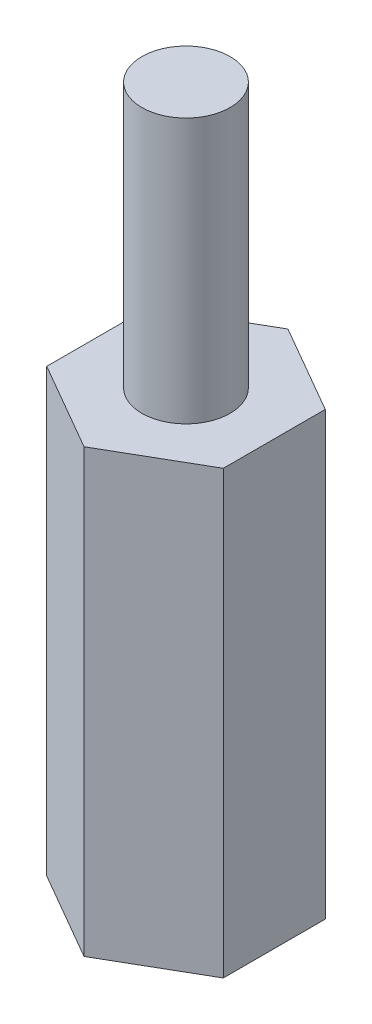
ISO-10303-21;
HEADER;
FILE_DESCRIPTION(('STEP AP214'),'2;1');
FILE_NAME('part.step','',(''),(''),'','','');
FILE_SCHEMA(('AUTOMOTIVE_DESIGN { 1 0 10303 214 1 1 1 1 }'));
ENDSEC;
DATA;
#1=APPLICATION_CONTEXT('core data for automotive mechanical design processes');
#2=APPLICATION_PROTOCOL_DEFINITION('international standard','automotive_design',2000,#1);
#3=PRODUCT_CONTEXT('',#1,'mechanical');
#4=PRODUCT('Part','Part','',(#3));
#5=PRODUCT_RELATED_PRODUCT_CATEGORY('part','',(#4));
#6=PRODUCT_DEFINITION_FORMATION('','',#4);
#7=PRODUCT_DEFINITION_CONTEXT('part definition',#1,'design');
#8=PRODUCT_DEFINITION('design','',#6,#7);
#9=PRODUCT_DEFINITION_SHAPE('','',#8);
#10=(LENGTH_UNIT() NAMED_UNIT(*) SI_UNIT(.MILLI.,.METRE.));
#11=(NAMED_UNIT(*) PLANE_ANGLE_UNIT() SI_UNIT($,.RADIAN.));
#12=(NAMED_UNIT(*) SI_UNIT($,.STERADIAN.) SOLID_ANGLE_UNIT());
#13=UNCERTAINTY_MEASURE_WITH_UNIT(LENGTH_MEASURE(1.E-05),#10,'distance_accuracy_value','');
#14=(GEOMETRIC_REPRESENTATION_CONTEXT(3) GLOBAL_UNCERTAINTY_ASSIGNED_CONTEXT((#13)) GLOBAL_UNIT_ASSIGNED_CONTEXT((#10,
#11,#12)) REPRESENTATION_CONTEXT('',''));
#15=CARTESIAN_POINT('',(0.,0.,0.));
#16=DIRECTION('',(0.,0.,1.));
#17=DIRECTION('',(1.,0.,0.));
#18=AXIS2_PLACEMENT_3D('',#15,#16,#17);
#19=CARTESIAN_POINT('',(-1.99999999999999,10.,1.15470053837928));
#20=DIRECTION('',(0.499999999999995,0.,-0.866025403784441));
#21=DIRECTION('',(-0.866025403784441,0.,-0.499999999999995));
#22=AXIS2_PLACEMENT_3D('',#19,#20,#21);
#23=PLANE('',#22);
#24=DIRECTION('',(0.866025403784442,0.,0.499999999999995));
#25=VECTOR('',#24,1.);
#26=CARTESIAN_POINT('',(-1.99999999999999,0.,1.15470053837928));
#27=LINE('',#26,#25);
#28=CARTESIAN_POINT('',(-1.99999999999999,0.,1.15470053837928));
#29=VERTEX_POINT('',#28);
#30=CARTESIAN_POINT('',(0.,0.,2.30940107675851));
#31=VERTEX_POINT('',#30);
#32=EDGE_CURVE('E119',#29,#31,#27,.T.);
#33=ORIENTED_EDGE('',*,*,#32,.T.);
#34=DIRECTION('',(0.,-1.,0.));
#35=VECTOR('',#34,1.);
#36=CARTESIAN_POINT('',(0.,10.,2.30940107675851));
#37=LINE('',#36,#35);
#38=CARTESIAN_POINT('',(0.,10.,2.30940107675851));
#39=VERTEX_POINT('',#38);
#40=EDGE_CURVE('E36',#39,#31,#37,.T.);
#41=ORIENTED_EDGE('',*,*,#40,.F.);
#42=DIRECTION('',(0.866025403784442,0.,0.499999999999995));
#43=VECTOR('',#42,1.);
#44=CARTESIAN_POINT('',(-1.99999999999999,10.,1.15470053837928));
#45=LINE('',#44,#43);
#46=CARTESIAN_POINT('',(-1.99999999999999,10.,1.15470053837928));
#47=VERTEX_POINT('',#46);
#48=EDGE_CURVE('E130',#47,#39,#45,.T.);
#49=ORIENTED_EDGE('',*,*,#48,.F.);
#50=DIRECTION('',(0.,-1.,0.));
#51=VECTOR('',#50,1.);
#52=CARTESIAN_POINT('',(-1.99999999999999,10.,1.15470053837928));
#53=LINE('',#52,#51);
#54=EDGE_CURVE('E115',#47,#29,#53,.T.);
#55=ORIENTED_EDGE('',*,*,#54,.T.);
#56=EDGE_LOOP('',(#33,#41,#49,#55));
#57=FACE_BOUND('',#56,.T.);
#58=ADVANCED_FACE('F33',(#57),#23,.F.);
#59=CARTESIAN_POINT('',(0.,10.,2.30940107675851));
#60=DIRECTION('',(-0.500000000000001,0.,-0.866025403784438));
#61=DIRECTION('',(-0.866025403784438,0.,0.500000000000001));
#62=AXIS2_PLACEMENT_3D('',#59,#60,#61);
#63=PLANE('',#62);
#64=DIRECTION('',(0.866025403784438,0.,-0.500000000000001));
#65=VECTOR('',#64,1.);
#66=CARTESIAN_POINT('',(0.,0.,2.30940107675851));
#67=LINE('',#66,#65);
#68=CARTESIAN_POINT('',(2.,0.,1.15470053837925));
#69=VERTEX_POINT('',#68);
#70=EDGE_CURVE('E122',#31,#69,#67,.T.);
#71=ORIENTED_EDGE('',*,*,#70,.T.);
#72=DIRECTION('',(0.,-1.,0.));
#73=VECTOR('',#72,1.);
#74=CARTESIAN_POINT('',(2.,10.,1.15470053837925));
#75=LINE('',#74,#73);
#76=CARTESIAN_POINT('',(2.,10.,1.15470053837925));
#77=VERTEX_POINT('',#76);
#78=EDGE_CURVE('E133',#77,#69,#75,.T.);
#79=ORIENTED_EDGE('',*,*,#78,.F.);
#80=DIRECTION('',(0.866025403784438,0.,-0.500000000000001));
#81=VECTOR('',#80,1.);
#82=CARTESIAN_POINT('',(0.,10.,2.30940107675851));
#83=LINE('',#82,#81);
#84=EDGE_CURVE('E88',#39,#77,#83,.T.);
#85=ORIENTED_EDGE('',*,*,#84,.F.);
#86=ORIENTED_EDGE('',*,*,#40,.T.);
#87=EDGE_LOOP('',(#71,#79,#85,#86));
#88=FACE_BOUND('',#87,.T.);
#89=ADVANCED_FACE('F138',(#88),#63,.F.);
#90=CARTESIAN_POINT('',(2.,10.,1.15470053837925));
#91=DIRECTION('',(-1.,0.,0.));
#92=DIRECTION('',(0.,0.,1.));
#93=AXIS2_PLACEMENT_3D('',#90,#91,#92);
#94=PLANE('',#93);
#95=DIRECTION('',(0.,0.,-1.));
#96=VECTOR('',#95,1.);
#97=CARTESIAN_POINT('',(2.,0.,1.15470053837925));
#98=LINE('',#97,#96);
#99=CARTESIAN_POINT('',(2.,0.,-1.15470053837926));
#100=VERTEX_POINT('',#99);
#101=EDGE_CURVE('E125',#69,#100,#98,.T.);
#102=ORIENTED_EDGE('',*,*,#101,.T.);
#103=DIRECTION('',(0.,-1.,0.));
#104=VECTOR('',#103,1.);
#105=CARTESIAN_POINT('',(2.,10.,-1.15470053837926));
#106=LINE('',#105,#104);
#107=CARTESIAN_POINT('',(2.,10.,-1.15470053837926));
#108=VERTEX_POINT('',#107);
#109=EDGE_CURVE('E110',#108,#100,#106,.T.);
#110=ORIENTED_EDGE('',*,*,#109,.F.);
#111=DIRECTION('',(0.,0.,-1.));
#112=VECTOR('',#111,1.);
#113=CARTESIAN_POINT('',(2.,10.,1.15470053837925));
#114=LINE('',#113,#112);
#115=EDGE_CURVE('E101',#77,#108,#114,.T.);
#116=ORIENTED_EDGE('',*,*,#115,.F.);
#117=ORIENTED_EDGE('',*,*,#78,.T.);
#118=EDGE_LOOP('',(#102,#110,#116,#117));
#119=FACE_BOUND('',#118,.T.);
#120=ADVANCED_FACE('F144',(#119),#94,.F.);
#121=CARTESIAN_POINT('',(2.,10.,-1.15470053837926));
#122=DIRECTION('',(-0.499999999999995,0.,0.866025403784442));
#123=DIRECTION('',(0.866025403784442,0.,0.499999999999995));
#124=AXIS2_PLACEMENT_3D('',#121,#122,#123);
#125=PLANE('',#124);
#126=DIRECTION('',(-0.866025403784441,0.,-0.499999999999995));
#127=VECTOR('',#126,1.);
#128=CARTESIAN_POINT('',(2.,0.,-1.15470053837926));
#129=LINE('',#128,#127);
#130=CARTESIAN_POINT('',(0.,0.,-2.3094010767585));
#131=VERTEX_POINT('',#130);
#132=EDGE_CURVE('E109',#100,#131,#129,.T.);
#133=ORIENTED_EDGE('',*,*,#132,.T.);
#134=DIRECTION('',(0.,-1.,0.));
#135=VECTOR('',#134,1.);
#136=CARTESIAN_POINT('',(0.,10.,-2.3094010767585));
#137=LINE('',#136,#135);
#138=CARTESIAN_POINT('',(0.,10.,-2.3094010767585));
#139=VERTEX_POINT('',#138);
#140=EDGE_CURVE('E106',#139,#131,#137,.T.);
#141=ORIENTED_EDGE('',*,*,#140,.F.);
#142=DIRECTION('',(-0.866025403784441,0.,-0.499999999999995));
#143=VECTOR('',#142,1.);
#144=CARTESIAN_POINT('',(2.,10.,-1.15470053837926));
#145=LINE('',#144,#143);
#146=EDGE_CURVE('E95',#108,#139,#145,.T.);
#147=ORIENTED_EDGE('',*,*,#146,.F.);
#148=ORIENTED_EDGE('',*,*,#109,.T.);
#149=EDGE_LOOP('',(#133,#141,#147,#148));
#150=FACE_BOUND('',#149,.T.);
#151=ADVANCED_FACE('F107',(#150),#125,.F.);
#152=CARTESIAN_POINT('',(0.,10.,-2.3094010767585));
#153=DIRECTION('',(0.500000000000007,0.,0.866025403784434));
#154=DIRECTION('',(0.866025403784435,0.,-0.500000000000007));
#155=AXIS2_PLACEMENT_3D('',#152,#153,#154);
#156=PLANE('',#155);
#157=DIRECTION('',(-0.866025403784434,0.,0.500000000000007));
#158=VECTOR('',#157,1.);
#159=CARTESIAN_POINT('',(0.,0.,-2.3094010767585));
#160=LINE('',#159,#158);
#161=CARTESIAN_POINT('',(-2.00000000000001,0.,-1.15470053837923));
#162=VERTEX_POINT('',#161);
#163=EDGE_CURVE('E73',#131,#162,#160,.T.);
#164=ORIENTED_EDGE('',*,*,#163,.T.);
#165=DIRECTION('',(0.,-1.,0.));
#166=VECTOR('',#165,1.);
#167=CARTESIAN_POINT('',(-2.00000000000001,10.,-1.15470053837923));
#168=LINE('',#167,#166);
#169=CARTESIAN_POINT('',(-2.00000000000001,10.,-1.15470053837923));
#170=VERTEX_POINT('',#169);
#171=EDGE_CURVE('E111',#170,#162,#168,.T.);
#172=ORIENTED_EDGE('',*,*,#171,.F.);
#173=DIRECTION('',(-0.866025403784434,0.,0.500000000000007));
#174=VECTOR('',#173,1.);
#175=CARTESIAN_POINT('',(0.,10.,-2.3094010767585));
#176=LINE('',#175,#174);
#177=EDGE_CURVE('E99',#139,#170,#176,.T.);
#178=ORIENTED_EDGE('',*,*,#177,.F.);
#179=ORIENTED_EDGE('',*,*,#140,.T.);
#180=EDGE_LOOP('',(#164,#172,#178,#179));
#181=FACE_BOUND('',#180,.T.);
#182=ADVANCED_FACE('F113',(#181),#156,.F.);
#183=CARTESIAN_POINT('',(-2.00000000000001,10.,-1.15470053837923));
#184=DIRECTION('',(1.,0.,0.));
#185=DIRECTION('',(0.,0.,-1.));
#186=AXIS2_PLACEMENT_3D('',#183,#184,#185);
#187=PLANE('',#186);
#188=DIRECTION('',(0.,0.,1.));
#189=VECTOR('',#188,1.);
#190=CARTESIAN_POINT('',(-2.00000000000001,0.,-1.15470053837923));
#191=LINE('',#190,#189);
#192=EDGE_CURVE('E79',#162,#29,#191,.T.);
#193=ORIENTED_EDGE('',*,*,#192,.T.);
#194=ORIENTED_EDGE('',*,*,#54,.F.);
#195=DIRECTION('',(0.,0.,1.));
#196=VECTOR('',#195,1.);
#197=CARTESIAN_POINT('',(-2.00000000000001,10.,-1.15470053837923));
#198=LINE('',#197,#196);
#199=EDGE_CURVE('E50',#170,#47,#198,.T.);
#200=ORIENTED_EDGE('',*,*,#199,.F.);
#201=ORIENTED_EDGE('',*,*,#171,.T.);
#202=EDGE_LOOP('',(#193,#194,#200,#201));
#203=FACE_BOUND('',#202,.T.);
#204=ADVANCED_FACE('F160',(#203),#187,.F.);
#205=CARTESIAN_POINT('',(0.,10.,0.));
#206=DIRECTION('',(0.,1.,0.));
#207=DIRECTION('',(0.,0.,1.));
#208=AXIS2_PLACEMENT_3D('',#205,#206,#207);
#209=PLANE('',#208);
#210=CARTESIAN_POINT('',(0.,10.,0.));
#211=DIRECTION('',(0.,1.,0.));
#212=DIRECTION('',(0.,0.,1.));
#213=AXIS2_PLACEMENT_3D('',#210,#211,#212);
#214=CIRCLE('',#213,1.);
#215=CARTESIAN_POINT('',(0.,10.,1.));
#216=VERTEX_POINT('',#215);
#217=EDGE_CURVE('E11',#216,#216,#214,.T.);
#218=ORIENTED_EDGE('',*,*,#217,.F.);
#219=EDGE_LOOP('',(#218));
#220=FACE_BOUND('',#219,.T.);
#221=ORIENTED_EDGE('',*,*,#48,.T.);
#222=ORIENTED_EDGE('',*,*,#84,.T.);
#223=ORIENTED_EDGE('',*,*,#115,.T.);
#224=ORIENTED_EDGE('',*,*,#146,.T.);
#225=ORIENTED_EDGE('',*,*,#177,.T.);
#226=ORIENTED_EDGE('',*,*,#199,.T.);
#227=EDGE_LOOP('',(#221,#222,#223,#224,#225,#226));
#228=FACE_BOUND('',#227,.T.);
#229=ADVANCED_FACE('F97',(#220,#228),#209,.T.);
#230=CARTESIAN_POINT('',(0.,0.,0.));
#231=DIRECTION('',(0.,1.,0.));
#232=DIRECTION('',(0.,0.,1.));
#233=AXIS2_PLACEMENT_3D('',#230,#231,#232);
#234=PLANE('',#233);
#235=ORIENTED_EDGE('',*,*,#32,.F.);
#236=ORIENTED_EDGE('',*,*,#192,.F.);
#237=ORIENTED_EDGE('',*,*,#163,.F.);
#238=ORIENTED_EDGE('',*,*,#132,.F.);
#239=ORIENTED_EDGE('',*,*,#101,.F.);
#240=ORIENTED_EDGE('',*,*,#70,.F.);
#241=EDGE_LOOP('',(#235,#236,#237,#238,#239,#240));
#242=FACE_BOUND('',#241,.T.);
#243=ADVANCED_FACE('F143',(#242),#234,.F.);
#244=CARTESIAN_POINT('',(0.,16.,0.));
#245=DIRECTION('',(0.,-1.,0.));
#246=DIRECTION('',(0.,0.,-1.));
#247=AXIS2_PLACEMENT_3D('',#244,#245,#246);
#248=CYLINDRICAL_SURFACE('',#247,1.);
#249=CARTESIAN_POINT('',(0.,16.,0.));
#250=DIRECTION('',(0.,1.,0.));
#251=DIRECTION('',(0.,0.,1.));
#252=AXIS2_PLACEMENT_3D('',#249,#250,#251);
#253=CIRCLE('',#252,1.);
#254=CARTESIAN_POINT('',(0.,16.,1.));
#255=VERTEX_POINT('',#254);
#256=EDGE_CURVE('E123',#255,#255,#253,.T.);
#257=ORIENTED_EDGE('',*,*,#256,.F.);
#258=EDGE_LOOP('',(#257));
#259=FACE_BOUND('',#258,.T.);
#260=ORIENTED_EDGE('',*,*,#217,.T.);
#261=EDGE_LOOP('',(#260));
#262=FACE_BOUND('',#261,.T.);
#263=ADVANCED_FACE('F153',(#259,#262),#248,.T.);
#264=CARTESIAN_POINT('',(0.,16.,0.));
#265=DIRECTION('',(0.,1.,0.));
#266=DIRECTION('',(0.,0.,1.));
#267=AXIS2_PLACEMENT_3D('',#264,#265,#266);
#268=PLANE('',#267);
#269=ORIENTED_EDGE('',*,*,#256,.T.);
#270=EDGE_LOOP('',(#269));
#271=FACE_BOUND('',#270,.T.);
#272=ADVANCED_FACE('F151',(#271),#268,.T.);
#273=CLOSED_SHELL('',(#58,#89,#120,#151,#182,#204,#229,#243,#263,#272));
#274=MANIFOLD_SOLID_BREP('B2',#273);
#275=ADVANCED_BREP_SHAPE_REPRESENTATION('',(#18,#274),#14);
#276=SHAPE_DEFINITION_REPRESENTATION(#9,#275);
ENDSEC;
END-ISO-10303-21;
